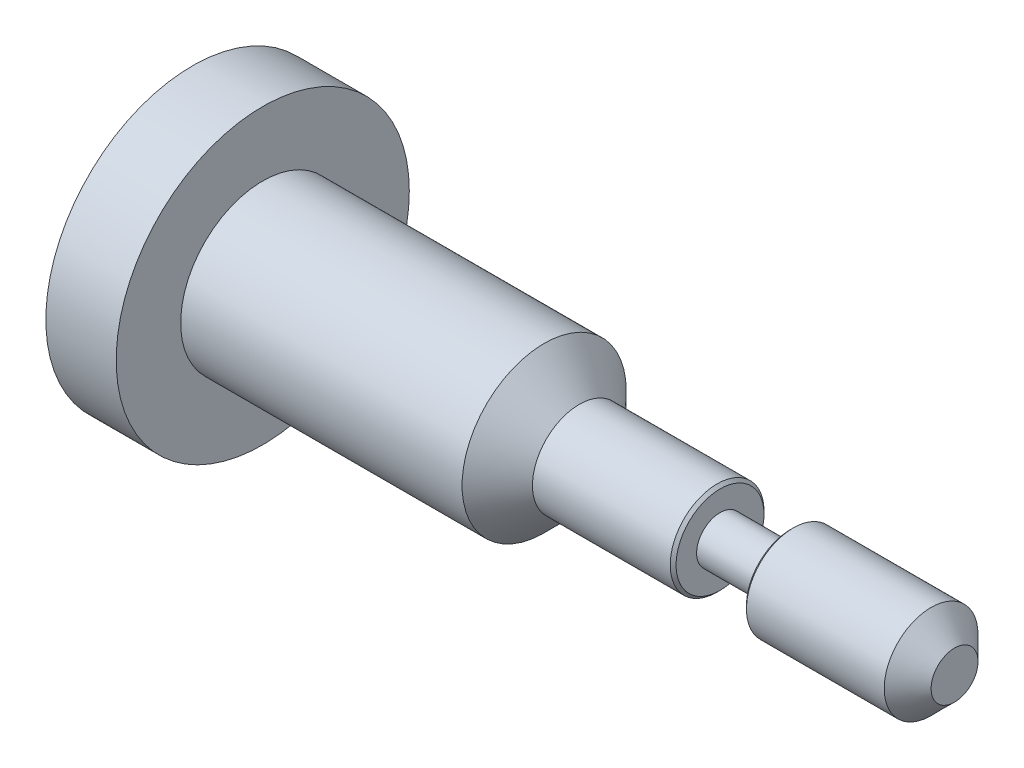
ISO-10303-21;
HEADER;
FILE_DESCRIPTION(('STEP AP214'),'2;1');
FILE_NAME('part.step','',(''),(''),'','','');
FILE_SCHEMA(('AUTOMOTIVE_DESIGN { 1 0 10303 214 1 1 1 1 }'));
ENDSEC;
DATA;
#1=APPLICATION_CONTEXT('core data for automotive mechanical design processes');
#2=APPLICATION_PROTOCOL_DEFINITION('international standard','automotive_design',2000,#1);
#3=PRODUCT_CONTEXT('',#1,'mechanical');
#4=PRODUCT('Part','Part','',(#3));
#5=PRODUCT_RELATED_PRODUCT_CATEGORY('part','',(#4));
#6=PRODUCT_DEFINITION_FORMATION('','',#4);
#7=PRODUCT_DEFINITION_CONTEXT('part definition',#1,'design');
#8=PRODUCT_DEFINITION('design','',#6,#7);
#9=PRODUCT_DEFINITION_SHAPE('','',#8);
#10=(LENGTH_UNIT() NAMED_UNIT(*) SI_UNIT(.MILLI.,.METRE.));
#11=(NAMED_UNIT(*) PLANE_ANGLE_UNIT() SI_UNIT($,.RADIAN.));
#12=(NAMED_UNIT(*) SI_UNIT($,.STERADIAN.) SOLID_ANGLE_UNIT());
#13=UNCERTAINTY_MEASURE_WITH_UNIT(LENGTH_MEASURE(1.E-05),#10,'distance_accuracy_value','');
#14=(GEOMETRIC_REPRESENTATION_CONTEXT(3) GLOBAL_UNCERTAINTY_ASSIGNED_CONTEXT((#13)) GLOBAL_UNIT_ASSIGNED_CONTEXT((#10,
#11,#12)) REPRESENTATION_CONTEXT('',''));
#15=CARTESIAN_POINT('',(0.,0.,0.));
#16=DIRECTION('',(0.,0.,1.));
#17=DIRECTION('',(1.,0.,0.));
#18=AXIS2_PLACEMENT_3D('',#15,#16,#17);
#19=CARTESIAN_POINT('',(0.,0.,0.));
#20=DIRECTION('',(-1.,0.,0.));
#21=DIRECTION('',(0.,0.,1.));
#22=AXIS2_PLACEMENT_3D('',#19,#20,#21);
#23=PLANE('',#22);
#24=CARTESIAN_POINT('',(0.,0.,0.));
#25=DIRECTION('',(1.,0.,0.));
#26=DIRECTION('',(0.,0.,-1.));
#27=AXIS2_PLACEMENT_3D('',#24,#25,#26);
#28=CIRCLE('',#27,1.5);
#29=CARTESIAN_POINT('',(0.,0.,1.5));
#30=VERTEX_POINT('',#29);
#31=EDGE_CURVE('E10',#30,#30,#28,.T.);
#32=ORIENTED_EDGE('',*,*,#31,.F.);
#33=EDGE_LOOP('',(#32));
#34=FACE_BOUND('',#33,.T.);
#35=ADVANCED_FACE('F36',(#34),#23,.T.);
#36=CARTESIAN_POINT('',(-1.5,0.,0.));
#37=DIRECTION('',(-1.,0.,0.));
#38=DIRECTION('',(0.,0.,1.));
#39=AXIS2_PLACEMENT_3D('',#36,#37,#38);
#40=CONICAL_SURFACE('',#39,5.,1.16590454050981);
#41=CARTESIAN_POINT('',(-1.5,0.,0.));
#42=DIRECTION('',(1.,0.,0.));
#43=DIRECTION('',(0.,0.,-1.));
#44=AXIS2_PLACEMENT_3D('',#41,#42,#43);
#45=CIRCLE('',#44,5.);
#46=CARTESIAN_POINT('',(-1.5,0.,5.));
#47=VERTEX_POINT('',#46);
#48=EDGE_CURVE('E42',#47,#47,#45,.T.);
#49=CARTESIAN_POINT('',(0.,0.,1.5));
#50=CARTESIAN_POINT('',(-0.0156250000000001,0.,1.53645833333333));
#51=CARTESIAN_POINT('',(-0.0312500000000001,0.,1.57291666666667));
#52=CARTESIAN_POINT('',(-0.0625,0.,1.64583333333333));
#53=CARTESIAN_POINT('',(-0.078125,0.,1.68229166666667));
#54=CARTESIAN_POINT('',(-0.109375,0.,1.75520833333333));
#55=CARTESIAN_POINT('',(-0.125,0.,1.79166666666667));
#56=CARTESIAN_POINT('',(-0.15625,0.,1.86458333333333));
#57=CARTESIAN_POINT('',(-0.171875,0.,1.90104166666667));
#58=CARTESIAN_POINT('',(-0.203125,0.,1.97395833333333));
#59=CARTESIAN_POINT('',(-0.21875,0.,2.01041666666667));
#60=CARTESIAN_POINT('',(-0.25,0.,2.08333333333333));
#61=CARTESIAN_POINT('',(-0.265625,0.,2.11979166666667));
#62=CARTESIAN_POINT('',(-0.296875,0.,2.19270833333333));
#63=CARTESIAN_POINT('',(-0.3125,0.,2.22916666666667));
#64=CARTESIAN_POINT('',(-0.34375,0.,2.30208333333333));
#65=CARTESIAN_POINT('',(-0.359375,0.,2.33854166666667));
#66=CARTESIAN_POINT('',(-0.390625,0.,2.41145833333333));
#67=CARTESIAN_POINT('',(-0.40625,0.,2.44791666666667));
#68=CARTESIAN_POINT('',(-0.4375,0.,2.52083333333333));
#69=CARTESIAN_POINT('',(-0.453125,0.,2.55729166666667));
#70=CARTESIAN_POINT('',(-0.484375,0.,2.63020833333333));
#71=CARTESIAN_POINT('',(-0.5,0.,2.66666666666667));
#72=CARTESIAN_POINT('',(-0.53125,0.,2.73958333333333));
#73=CARTESIAN_POINT('',(-0.546875000000001,0.,2.77604166666667));
#74=CARTESIAN_POINT('',(-0.578125000000001,0.,2.84895833333333));
#75=CARTESIAN_POINT('',(-0.593750000000001,0.,2.88541666666667));
#76=CARTESIAN_POINT('',(-0.625000000000001,0.,2.95833333333333));
#77=CARTESIAN_POINT('',(-0.640625000000001,0.,2.99479166666667));
#78=CARTESIAN_POINT('',(-0.671875000000001,0.,3.06770833333333));
#79=CARTESIAN_POINT('',(-0.687500000000001,0.,3.10416666666667));
#80=CARTESIAN_POINT('',(-0.718750000000001,0.,3.17708333333333));
#81=CARTESIAN_POINT('',(-0.734375000000001,0.,3.21354166666667));
#82=CARTESIAN_POINT('',(-0.765625000000001,0.,3.28645833333333));
#83=CARTESIAN_POINT('',(-0.781250000000001,0.,3.32291666666667));
#84=CARTESIAN_POINT('',(-0.812500000000001,0.,3.39583333333333));
#85=CARTESIAN_POINT('',(-0.828125000000001,0.,3.43229166666667));
#86=CARTESIAN_POINT('',(-0.859375000000001,0.,3.50520833333333));
#87=CARTESIAN_POINT('',(-0.875000000000001,0.,3.54166666666667));
#88=CARTESIAN_POINT('',(-0.906250000000001,0.,3.61458333333333));
#89=CARTESIAN_POINT('',(-0.921875000000001,0.,3.65104166666667));
#90=CARTESIAN_POINT('',(-0.953125000000001,0.,3.72395833333333));
#91=CARTESIAN_POINT('',(-0.968750000000001,0.,3.76041666666667));
#92=CARTESIAN_POINT('',(-1.,0.,3.83333333333333));
#93=CARTESIAN_POINT('',(-1.015625,0.,3.86979166666667));
#94=CARTESIAN_POINT('',(-1.046875,0.,3.94270833333333));
#95=CARTESIAN_POINT('',(-1.0625,0.,3.97916666666667));
#96=CARTESIAN_POINT('',(-1.09375,0.,4.05208333333333));
#97=CARTESIAN_POINT('',(-1.109375,0.,4.08854166666667));
#98=CARTESIAN_POINT('',(-1.140625,0.,4.16145833333333));
#99=CARTESIAN_POINT('',(-1.15625,0.,4.19791666666667));
#100=CARTESIAN_POINT('',(-1.1875,0.,4.27083333333333));
#101=CARTESIAN_POINT('',(-1.203125,0.,4.30729166666667));
#102=CARTESIAN_POINT('',(-1.234375,0.,4.38020833333333));
#103=CARTESIAN_POINT('',(-1.25,0.,4.41666666666667));
#104=CARTESIAN_POINT('',(-1.28125,0.,4.48958333333333));
#105=CARTESIAN_POINT('',(-1.296875,0.,4.52604166666667));
#106=CARTESIAN_POINT('',(-1.328125,0.,4.59895833333333));
#107=CARTESIAN_POINT('',(-1.34375,0.,4.63541666666667));
#108=CARTESIAN_POINT('',(-1.375,0.,4.70833333333333));
#109=CARTESIAN_POINT('',(-1.390625,0.,4.74479166666667));
#110=CARTESIAN_POINT('',(-1.421875,0.,4.81770833333333));
#111=CARTESIAN_POINT('',(-1.4375,0.,4.85416666666667));
#112=CARTESIAN_POINT('',(-1.46875,0.,4.92708333333333));
#113=CARTESIAN_POINT('',(-1.484375,0.,4.96354166666667));
#114=CARTESIAN_POINT('',(-1.5,0.,5.));
#115=B_SPLINE_CURVE_WITH_KNOTS('',3,(#49,#50,#51,#52,#53,#54,#55,#56,#57,#58,#59,#60,#61,#62,
#63,#64,#65,#66,#67,#68,#69,#70,#71,#72,#73,#74,#75,#76,#77,#78,#79,#80,#81,#82,#83,#84,#85,#86,
#87,#88,#89,#90,#91,#92,#93,#94,#95,#96,#97,#98,#99,#100,#101,#102,#103,#104,#105,#106,#107,
#108,#109,#110,#111,#112,#113,#114),.UNSPECIFIED.,.F.,.F.,(4,2,2,2,2,2,2,2,2,2,2,2,2,2,2,2,2,2,
2,2,2,2,2,2,2,2,2,2,2,2,2,2,4),(0.,0.118996454779124,0.237992909558247,0.356989364337371,
0.475985819116494,0.594982273895618,0.713978728674741,0.832975183453865,0.951971638232989,
1.07096809301211,1.18996454779124,1.30896100257036,1.42795745734948,1.54695391212861,
1.66595036690773,1.78494682168685,1.90394327646598,2.0229397312451,2.14193618602422,
2.26093264080335,2.37992909558247,2.4989255503616,2.61792200514072,2.73691845991984,
2.85591491469897,2.97491136947809,3.09390782425721,3.21290427903634,3.33190073381546,
3.45089718859458,3.56989364337371,3.68889009815283,3.80788655293196),.UNSPECIFIED.);
#116=EDGE_CURVE('BSEAM104',#30,#47,#115,.T.);
#117=ORIENTED_EDGE('',*,*,#31,.T.);
#118=ORIENTED_EDGE('',*,*,#48,.F.);
#119=ORIENTED_EDGE('',*,*,#116,.T.);
#120=ORIENTED_EDGE('',*,*,#116,.F.);
#121=EDGE_LOOP('',(#117,#119,#118,#120));
#122=FACE_BOUND('',#121,.T.);
#123=ADVANCED_FACE('F104',(#122),#40,.F.);
#124=CARTESIAN_POINT('',(-1.5,5.,0.));
#125=DIRECTION('',(-1.,0.,0.));
#126=DIRECTION('',(0.,0.,1.));
#127=AXIS2_PLACEMENT_3D('',#124,#125,#126);
#128=PLANE('',#127);
#129=ORIENTED_EDGE('',*,*,#48,.T.);
#130=EDGE_LOOP('',(#129));
#131=FACE_BOUND('',#130,.T.);
#132=CARTESIAN_POINT('',(-1.5,0.,0.));
#133=DIRECTION('',(1.,0.,0.));
#134=DIRECTION('',(0.,0.,-1.));
#135=AXIS2_PLACEMENT_3D('',#132,#133,#134);
#136=CIRCLE('',#135,6.25);
#137=CARTESIAN_POINT('',(-1.5,0.,-6.25));
#138=VERTEX_POINT('',#137);
#139=EDGE_CURVE('E46',#138,#138,#136,.T.);
#140=ORIENTED_EDGE('',*,*,#139,.F.);
#141=EDGE_LOOP('',(#140));
#142=FACE_BOUND('',#141,.T.);
#143=ADVANCED_FACE('F108',(#131,#142),#128,.T.);
#144=CARTESIAN_POINT('',(31.,0.,0.));
#145=DIRECTION('',(1.,0.,0.));
#146=DIRECTION('',(0.,0.,-1.));
#147=AXIS2_PLACEMENT_3D('',#144,#145,#146);
#148=CYLINDRICAL_SURFACE('',#147,6.25);
#149=ORIENTED_EDGE('',*,*,#139,.T.);
#150=EDGE_LOOP('',(#149));
#151=FACE_BOUND('',#150,.T.);
#152=CARTESIAN_POINT('',(1.5,0.,0.));
#153=DIRECTION('',(1.,0.,0.));
#154=DIRECTION('',(0.,0.,-1.));
#155=AXIS2_PLACEMENT_3D('',#152,#153,#154);
#156=CIRCLE('',#155,6.25);
#157=CARTESIAN_POINT('',(1.5,0.,-6.25));
#158=VERTEX_POINT('',#157);
#159=EDGE_CURVE('E50',#158,#158,#156,.T.);
#160=ORIENTED_EDGE('',*,*,#159,.F.);
#161=EDGE_LOOP('',(#160));
#162=FACE_BOUND('',#161,.T.);
#163=ADVANCED_FACE('F111',(#151,#162),#148,.T.);
#164=CARTESIAN_POINT('',(1.5,6.25,0.));
#165=DIRECTION('',(1.,0.,0.));
#166=DIRECTION('',(0.,0.,-1.));
#167=AXIS2_PLACEMENT_3D('',#164,#165,#166);
#168=PLANE('',#167);
#169=ORIENTED_EDGE('',*,*,#159,.T.);
#170=EDGE_LOOP('',(#169));
#171=FACE_BOUND('',#170,.T.);
#172=CARTESIAN_POINT('',(1.5,0.,0.));
#173=DIRECTION('',(1.,0.,0.));
#174=DIRECTION('',(0.,0.,-1.));
#175=AXIS2_PLACEMENT_3D('',#172,#173,#174);
#176=CIRCLE('',#175,3.5);
#177=CARTESIAN_POINT('',(1.5,0.,-3.5));
#178=VERTEX_POINT('',#177);
#179=EDGE_CURVE('E55',#178,#178,#176,.T.);
#180=ORIENTED_EDGE('',*,*,#179,.F.);
#181=EDGE_LOOP('',(#180));
#182=FACE_BOUND('',#181,.T.);
#183=ADVANCED_FACE('F117',(#171,#182),#168,.T.);
#184=CARTESIAN_POINT('',(31.,0.,0.));
#185=DIRECTION('',(1.,0.,0.));
#186=DIRECTION('',(0.,0.,-1.));
#187=AXIS2_PLACEMENT_3D('',#184,#185,#186);
#188=CYLINDRICAL_SURFACE('',#187,3.5);
#189=ORIENTED_EDGE('',*,*,#179,.T.);
#190=EDGE_LOOP('',(#189));
#191=FACE_BOUND('',#190,.T.);
#192=CARTESIAN_POINT('',(13.5,0.,0.));
#193=DIRECTION('',(1.,0.,0.));
#194=DIRECTION('',(0.,0.,-1.));
#195=AXIS2_PLACEMENT_3D('',#192,#193,#194);
#196=CIRCLE('',#195,3.5);
#197=CARTESIAN_POINT('',(13.5,0.,-3.5));
#198=VERTEX_POINT('',#197);
#199=EDGE_CURVE('E58',#198,#198,#196,.T.);
#200=ORIENTED_EDGE('',*,*,#199,.F.);
#201=EDGE_LOOP('',(#200));
#202=FACE_BOUND('',#201,.T.);
#203=ADVANCED_FACE('F121',(#191,#202),#188,.T.);
#204=CARTESIAN_POINT('',(15.,0.,0.));
#205=DIRECTION('',(-1.,0.,0.));
#206=DIRECTION('',(0.,0.,1.));
#207=AXIS2_PLACEMENT_3D('',#204,#205,#206);
#208=CONICAL_SURFACE('',#207,2.,0.78539816339745);
#209=ORIENTED_EDGE('',*,*,#199,.T.);
#210=EDGE_LOOP('',(#209));
#211=FACE_BOUND('',#210,.T.);
#212=CARTESIAN_POINT('',(15.,0.,0.));
#213=DIRECTION('',(1.,0.,0.));
#214=DIRECTION('',(0.,0.,-1.));
#215=AXIS2_PLACEMENT_3D('',#212,#213,#214);
#216=CIRCLE('',#215,2.);
#217=CARTESIAN_POINT('',(15.,0.,-2.));
#218=VERTEX_POINT('',#217);
#219=EDGE_CURVE('E61',#218,#218,#216,.T.);
#220=ORIENTED_EDGE('',*,*,#219,.F.);
#221=EDGE_LOOP('',(#220));
#222=FACE_BOUND('',#221,.T.);
#223=ADVANCED_FACE('F125',(#211,#222),#208,.T.);
#224=CARTESIAN_POINT('',(31.,0.,0.));
#225=DIRECTION('',(1.,0.,0.));
#226=DIRECTION('',(0.,0.,-1.));
#227=AXIS2_PLACEMENT_3D('',#224,#225,#226);
#228=CYLINDRICAL_SURFACE('',#227,2.);
#229=ORIENTED_EDGE('',*,*,#219,.T.);
#230=EDGE_LOOP('',(#229));
#231=FACE_BOUND('',#230,.T.);
#232=CARTESIAN_POINT('',(20.875,0.,0.));
#233=DIRECTION('',(1.,0.,0.));
#234=DIRECTION('',(0.,0.,-1.));
#235=AXIS2_PLACEMENT_3D('',#232,#233,#234);
#236=CIRCLE('',#235,2.);
#237=CARTESIAN_POINT('',(20.875,0.,-2.));
#238=VERTEX_POINT('',#237);
#239=EDGE_CURVE('E64',#238,#238,#236,.T.);
#240=ORIENTED_EDGE('',*,*,#239,.F.);
#241=EDGE_LOOP('',(#240));
#242=FACE_BOUND('',#241,.T.);
#243=ADVANCED_FACE('F129',(#231,#242),#228,.T.);
#244=CARTESIAN_POINT('',(21.,0.,0.));
#245=DIRECTION('',(-1.,0.,0.));
#246=DIRECTION('',(0.,0.,1.));
#247=AXIS2_PLACEMENT_3D('',#244,#245,#246);
#248=CONICAL_SURFACE('',#247,1.875,0.78539816339745);
#249=ORIENTED_EDGE('',*,*,#239,.T.);
#250=EDGE_LOOP('',(#249));
#251=FACE_BOUND('',#250,.T.);
#252=CARTESIAN_POINT('',(21.,0.,0.));
#253=DIRECTION('',(1.,0.,0.));
#254=DIRECTION('',(0.,0.,-1.));
#255=AXIS2_PLACEMENT_3D('',#252,#253,#254);
#256=CIRCLE('',#255,1.875);
#257=CARTESIAN_POINT('',(21.,0.,-1.875));
#258=VERTEX_POINT('',#257);
#259=EDGE_CURVE('E67',#258,#258,#256,.T.);
#260=ORIENTED_EDGE('',*,*,#259,.F.);
#261=EDGE_LOOP('',(#260));
#262=FACE_BOUND('',#261,.T.);
#263=ADVANCED_FACE('F133',(#251,#262),#248,.T.);
#264=CARTESIAN_POINT('',(21.,1.875,0.));
#265=DIRECTION('',(1.,0.,0.));
#266=DIRECTION('',(0.,0.,-1.));
#267=AXIS2_PLACEMENT_3D('',#264,#265,#266);
#268=PLANE('',#267);
#269=ORIENTED_EDGE('',*,*,#259,.T.);
#270=EDGE_LOOP('',(#269));
#271=FACE_BOUND('',#270,.T.);
#272=CARTESIAN_POINT('',(21.,0.,0.));
#273=DIRECTION('',(1.,0.,0.));
#274=DIRECTION('',(0.,0.,-1.));
#275=AXIS2_PLACEMENT_3D('',#272,#273,#274);
#276=CIRCLE('',#275,1.);
#277=CARTESIAN_POINT('',(21.,0.,-1.));
#278=VERTEX_POINT('',#277);
#279=EDGE_CURVE('E70',#278,#278,#276,.T.);
#280=ORIENTED_EDGE('',*,*,#279,.F.);
#281=EDGE_LOOP('',(#280));
#282=FACE_BOUND('',#281,.T.);
#283=ADVANCED_FACE('F137',(#271,#282),#268,.T.);
#284=CARTESIAN_POINT('',(31.,0.,0.));
#285=DIRECTION('',(1.,0.,0.));
#286=DIRECTION('',(0.,0.,-1.));
#287=AXIS2_PLACEMENT_3D('',#284,#285,#286);
#288=CYLINDRICAL_SURFACE('',#287,1.);
#289=ORIENTED_EDGE('',*,*,#279,.T.);
#290=EDGE_LOOP('',(#289));
#291=FACE_BOUND('',#290,.T.);
#292=CARTESIAN_POINT('',(24.,0.,0.));
#293=DIRECTION('',(1.,0.,0.));
#294=DIRECTION('',(0.,0.,-1.));
#295=AXIS2_PLACEMENT_3D('',#292,#293,#294);
#296=CIRCLE('',#295,1.);
#297=CARTESIAN_POINT('',(24.,0.,-1.));
#298=VERTEX_POINT('',#297);
#299=EDGE_CURVE('E73',#298,#298,#296,.T.);
#300=ORIENTED_EDGE('',*,*,#299,.F.);
#301=EDGE_LOOP('',(#300));
#302=FACE_BOUND('',#301,.T.);
#303=ADVANCED_FACE('F141',(#291,#302),#288,.T.);
#304=CARTESIAN_POINT('',(24.,1.,0.));
#305=DIRECTION('',(-1.,0.,0.));
#306=DIRECTION('',(0.,0.,1.));
#307=AXIS2_PLACEMENT_3D('',#304,#305,#306);
#308=PLANE('',#307);
#309=ORIENTED_EDGE('',*,*,#299,.T.);
#310=EDGE_LOOP('',(#309));
#311=FACE_BOUND('',#310,.T.);
#312=CARTESIAN_POINT('',(24.,0.,0.));
#313=DIRECTION('',(1.,0.,0.));
#314=DIRECTION('',(0.,0.,-1.));
#315=AXIS2_PLACEMENT_3D('',#312,#313,#314);
#316=CIRCLE('',#315,1.875);
#317=CARTESIAN_POINT('',(24.,0.,-1.875));
#318=VERTEX_POINT('',#317);
#319=EDGE_CURVE('E76',#318,#318,#316,.T.);
#320=ORIENTED_EDGE('',*,*,#319,.F.);
#321=EDGE_LOOP('',(#320));
#322=FACE_BOUND('',#321,.T.);
#323=ADVANCED_FACE('F145',(#311,#322),#308,.T.);
#324=CARTESIAN_POINT('',(24.125,0.,0.));
#325=DIRECTION('',(1.,0.,0.));
#326=DIRECTION('',(0.,0.,-1.));
#327=AXIS2_PLACEMENT_3D('',#324,#325,#326);
#328=CONICAL_SURFACE('',#327,2.,0.785398163397434);
#329=ORIENTED_EDGE('',*,*,#319,.T.);
#330=EDGE_LOOP('',(#329));
#331=FACE_BOUND('',#330,.T.);
#332=CARTESIAN_POINT('',(24.125,0.,0.));
#333=DIRECTION('',(1.,0.,0.));
#334=DIRECTION('',(0.,0.,-1.));
#335=AXIS2_PLACEMENT_3D('',#332,#333,#334);
#336=CIRCLE('',#335,2.);
#337=CARTESIAN_POINT('',(24.125,0.,-2.));
#338=VERTEX_POINT('',#337);
#339=EDGE_CURVE('E79',#338,#338,#336,.T.);
#340=ORIENTED_EDGE('',*,*,#339,.F.);
#341=EDGE_LOOP('',(#340));
#342=FACE_BOUND('',#341,.T.);
#343=ADVANCED_FACE('F100',(#331,#342),#328,.T.);
#344=CARTESIAN_POINT('',(31.,0.,0.));
#345=DIRECTION('',(1.,0.,0.));
#346=DIRECTION('',(0.,0.,-1.));
#347=AXIS2_PLACEMENT_3D('',#344,#345,#346);
#348=CYLINDRICAL_SURFACE('',#347,2.);
#349=ORIENTED_EDGE('',*,*,#339,.T.);
#350=EDGE_LOOP('',(#349));
#351=FACE_BOUND('',#350,.T.);
#352=CARTESIAN_POINT('',(30.,0.,0.));
#353=DIRECTION('',(1.,0.,0.));
#354=DIRECTION('',(0.,0.,-1.));
#355=AXIS2_PLACEMENT_3D('',#352,#353,#354);
#356=CIRCLE('',#355,2.);
#357=CARTESIAN_POINT('',(30.,0.,-2.));
#358=VERTEX_POINT('',#357);
#359=EDGE_CURVE('E82',#358,#358,#356,.T.);
#360=ORIENTED_EDGE('',*,*,#359,.F.);
#361=EDGE_LOOP('',(#360));
#362=FACE_BOUND('',#361,.T.);
#363=ADVANCED_FACE('F93',(#351,#362),#348,.T.);
#364=CARTESIAN_POINT('',(31.,0.,0.));
#365=DIRECTION('',(-1.,0.,0.));
#366=DIRECTION('',(0.,0.,1.));
#367=AXIS2_PLACEMENT_3D('',#364,#365,#366);
#368=CONICAL_SURFACE('',#367,1.,0.78539816339745);
#369=ORIENTED_EDGE('',*,*,#359,.T.);
#370=EDGE_LOOP('',(#369));
#371=FACE_BOUND('',#370,.T.);
#372=CARTESIAN_POINT('',(31.,0.,0.));
#373=DIRECTION('',(1.,0.,0.));
#374=DIRECTION('',(0.,0.,-1.));
#375=AXIS2_PLACEMENT_3D('',#372,#373,#374);
#376=CIRCLE('',#375,1.);
#377=CARTESIAN_POINT('',(31.,0.,-1.));
#378=VERTEX_POINT('',#377);
#379=EDGE_CURVE('E85',#378,#378,#376,.T.);
#380=ORIENTED_EDGE('',*,*,#379,.F.);
#381=EDGE_LOOP('',(#380));
#382=FACE_BOUND('',#381,.T.);
#383=ADVANCED_FACE('F91',(#371,#382),#368,.T.);
#384=CARTESIAN_POINT('',(31.,1.,0.));
#385=DIRECTION('',(1.,0.,0.));
#386=DIRECTION('',(0.,0.,-1.));
#387=AXIS2_PLACEMENT_3D('',#384,#385,#386);
#388=PLANE('',#387);
#389=ORIENTED_EDGE('',*,*,#379,.T.);
#390=EDGE_LOOP('',(#389));
#391=FACE_BOUND('',#390,.T.);
#392=ADVANCED_FACE('F89',(#391),#388,.T.);
#393=CLOSED_SHELL('',(#35,#123,#143,#163,#183,#203,#223,#243,#263,#283,#303,#323,#343,#363,#383,#392));
#394=MANIFOLD_SOLID_BREP('B2',#393);
#395=ADVANCED_BREP_SHAPE_REPRESENTATION('',(#18,#394),#14);
#396=SHAPE_DEFINITION_REPRESENTATION(#9,#395);
ENDSEC;
END-ISO-10303-21;
